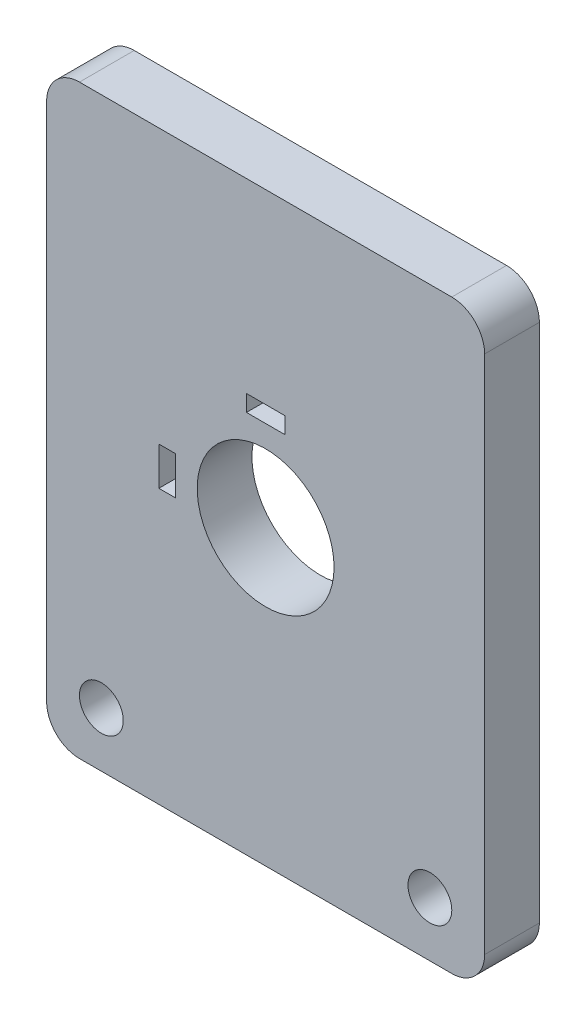
ISO-10303-21;
HEADER;
FILE_DESCRIPTION(('STEP AP214'),'2;1');
FILE_NAME('part.step','',(''),(''),'','','');
FILE_SCHEMA(('AUTOMOTIVE_DESIGN { 1 0 10303 214 1 1 1 1 }'));
ENDSEC;
DATA;
#1=APPLICATION_CONTEXT('core data for automotive mechanical design processes');
#2=APPLICATION_PROTOCOL_DEFINITION('international standard','automotive_design',2000,#1);
#3=PRODUCT_CONTEXT('',#1,'mechanical');
#4=PRODUCT('Part','Part','',(#3));
#5=PRODUCT_RELATED_PRODUCT_CATEGORY('part','',(#4));
#6=PRODUCT_DEFINITION_FORMATION('','',#4);
#7=PRODUCT_DEFINITION_CONTEXT('part definition',#1,'design');
#8=PRODUCT_DEFINITION('design','',#6,#7);
#9=PRODUCT_DEFINITION_SHAPE('','',#8);
#10=(LENGTH_UNIT() NAMED_UNIT(*) SI_UNIT(.MILLI.,.METRE.));
#11=(NAMED_UNIT(*) PLANE_ANGLE_UNIT() SI_UNIT($,.RADIAN.));
#12=(NAMED_UNIT(*) SI_UNIT($,.STERADIAN.) SOLID_ANGLE_UNIT());
#13=UNCERTAINTY_MEASURE_WITH_UNIT(LENGTH_MEASURE(1.E-05),#10,'distance_accuracy_value','');
#14=(GEOMETRIC_REPRESENTATION_CONTEXT(3) GLOBAL_UNCERTAINTY_ASSIGNED_CONTEXT((#13)) GLOBAL_UNIT_ASSIGNED_CONTEXT((#10,
#11,#12)) REPRESENTATION_CONTEXT('',''));
#15=CARTESIAN_POINT('',(0.,0.,0.));
#16=DIRECTION('',(0.,0.,1.));
#17=DIRECTION('',(1.,0.,0.));
#18=AXIS2_PLACEMENT_3D('',#15,#16,#17);
#19=CARTESIAN_POINT('',(0.,0.,5.));
#20=DIRECTION('',(0.,0.,-1.));
#21=DIRECTION('',(-1.,0.,0.));
#22=AXIS2_PLACEMENT_3D('',#19,#20,#21);
#23=PLANE('',#22);
#24=DIRECTION('',(-1.,0.,0.));
#25=VECTOR('',#24,1.);
#26=CARTESIAN_POINT('',(18.25,36.5,5.));
#27=LINE('',#26,#25);
#28=CARTESIAN_POINT('',(21.75,36.5,5.));
#29=VERTEX_POINT('',#28);
#30=CARTESIAN_POINT('',(18.25,36.5,5.));
#31=VERTEX_POINT('',#30);
#32=EDGE_CURVE('E193',#29,#31,#27,.T.);
#33=ORIENTED_EDGE('',*,*,#32,.F.);
#34=DIRECTION('',(0.,1.,0.));
#35=VECTOR('',#34,1.);
#36=CARTESIAN_POINT('',(21.75,36.5,5.));
#37=LINE('',#36,#35);
#38=CARTESIAN_POINT('',(21.75,35.,5.));
#39=VERTEX_POINT('',#38);
#40=EDGE_CURVE('E201',#39,#29,#37,.T.);
#41=ORIENTED_EDGE('',*,*,#40,.F.);
#42=DIRECTION('',(1.,0.,0.));
#43=VECTOR('',#42,1.);
#44=CARTESIAN_POINT('',(21.75,35.,5.));
#45=LINE('',#44,#43);
#46=CARTESIAN_POINT('',(18.25,35.,5.));
#47=VERTEX_POINT('',#46);
#48=EDGE_CURVE('E198',#47,#39,#45,.T.);
#49=ORIENTED_EDGE('',*,*,#48,.F.);
#50=DIRECTION('',(0.,-1.,0.));
#51=VECTOR('',#50,1.);
#52=CARTESIAN_POINT('',(18.25,35.,5.));
#53=LINE('',#52,#51);
#54=EDGE_CURVE('E195',#31,#47,#53,.T.);
#55=ORIENTED_EDGE('',*,*,#54,.F.);
#56=EDGE_LOOP('',(#33,#41,#49,#55));
#57=FACE_BOUND('',#56,.T.);
#58=DIRECTION('',(1.,0.,0.));
#59=VECTOR('',#58,1.);
#60=CARTESIAN_POINT('',(0.,0.,5.));
#61=LINE('',#60,#59);
#62=CARTESIAN_POINT('',(3.,0.,5.));
#63=VERTEX_POINT('',#62);
#64=CARTESIAN_POINT('',(37.,0.,5.));
#65=VERTEX_POINT('',#64);
#66=EDGE_CURVE('E245',#63,#65,#61,.T.);
#67=ORIENTED_EDGE('',*,*,#66,.T.);
#68=CARTESIAN_POINT('',(37.,3.,5.));
#69=DIRECTION('',(0.,0.,-1.));
#70=DIRECTION('',(-1.,0.,0.));
#71=AXIS2_PLACEMENT_3D('',#68,#69,#70);
#72=CIRCLE('',#71,3.);
#73=CARTESIAN_POINT('',(40.,3.,5.));
#74=VERTEX_POINT('',#73);
#75=EDGE_CURVE('E285',#65,#74,#72,.F.);
#76=ORIENTED_EDGE('',*,*,#75,.T.);
#77=DIRECTION('',(0.,1.,0.));
#78=VECTOR('',#77,1.);
#79=CARTESIAN_POINT('',(40.,0.,5.));
#80=LINE('',#79,#78);
#81=CARTESIAN_POINT('',(40.,50.5,5.));
#82=VERTEX_POINT('',#81);
#83=EDGE_CURVE('E249',#74,#82,#80,.T.);
#84=ORIENTED_EDGE('',*,*,#83,.T.);
#85=CARTESIAN_POINT('',(37.,50.5,5.));
#86=DIRECTION('',(0.,0.,-1.));
#87=DIRECTION('',(-1.,0.,0.));
#88=AXIS2_PLACEMENT_3D('',#85,#86,#87);
#89=CIRCLE('',#88,3.);
#90=CARTESIAN_POINT('',(37.,53.5,5.));
#91=VERTEX_POINT('',#90);
#92=EDGE_CURVE('E59',#82,#91,#89,.F.);
#93=ORIENTED_EDGE('',*,*,#92,.T.);
#94=DIRECTION('',(-1.,0.,0.));
#95=VECTOR('',#94,1.);
#96=CARTESIAN_POINT('',(0.,53.5,5.));
#97=LINE('',#96,#95);
#98=CARTESIAN_POINT('',(3.00000000000001,53.5,5.));
#99=VERTEX_POINT('',#98);
#100=EDGE_CURVE('E251',#91,#99,#97,.T.);
#101=ORIENTED_EDGE('',*,*,#100,.T.);
#102=CARTESIAN_POINT('',(3.00000000000001,50.5,5.));
#103=DIRECTION('',(0.,0.,-1.));
#104=DIRECTION('',(-1.,0.,0.));
#105=AXIS2_PLACEMENT_3D('',#102,#103,#104);
#106=CIRCLE('',#105,3.);
#107=CARTESIAN_POINT('',(0.,50.5,5.));
#108=VERTEX_POINT('',#107);
#109=EDGE_CURVE('E280',#99,#108,#106,.F.);
#110=ORIENTED_EDGE('',*,*,#109,.T.);
#111=DIRECTION('',(0.,-1.,0.));
#112=VECTOR('',#111,1.);
#113=CARTESIAN_POINT('',(0.,0.,5.));
#114=LINE('',#113,#112);
#115=CARTESIAN_POINT('',(0.,3.,5.));
#116=VERTEX_POINT('',#115);
#117=EDGE_CURVE('E242',#108,#116,#114,.T.);
#118=ORIENTED_EDGE('',*,*,#117,.T.);
#119=CARTESIAN_POINT('',(3.,3.,5.));
#120=DIRECTION('',(0.,0.,-1.));
#121=DIRECTION('',(-1.,0.,0.));
#122=AXIS2_PLACEMENT_3D('',#119,#120,#121);
#123=CIRCLE('',#122,3.);
#124=EDGE_CURVE('E282',#116,#63,#123,.F.);
#125=ORIENTED_EDGE('',*,*,#124,.T.);
#126=EDGE_LOOP('',(#67,#76,#84,#93,#101,#110,#118,#125));
#127=FACE_BOUND('',#126,.T.);
#128=CARTESIAN_POINT('',(35.,5.,5.));
#129=DIRECTION('',(0.,0.,1.));
#130=DIRECTION('',(1.,0.,0.));
#131=AXIS2_PLACEMENT_3D('',#128,#129,#130);
#132=CIRCLE('',#131,2.);
#133=CARTESIAN_POINT('',(37.,5.,5.));
#134=VERTEX_POINT('',#133);
#135=EDGE_CURVE('E236',#134,#134,#132,.T.);
#136=ORIENTED_EDGE('',*,*,#135,.F.);
#137=EDGE_LOOP('',(#136));
#138=FACE_BOUND('',#137,.T.);
#139=CARTESIAN_POINT('',(5.,5.,5.));
#140=DIRECTION('',(0.,0.,1.));
#141=DIRECTION('',(-1.,0.,0.));
#142=AXIS2_PLACEMENT_3D('',#139,#140,#141);
#143=CIRCLE('',#142,2.);
#144=CARTESIAN_POINT('',(3.,5.,5.));
#145=VERTEX_POINT('',#144);
#146=EDGE_CURVE('E230',#145,#145,#143,.T.);
#147=ORIENTED_EDGE('',*,*,#146,.F.);
#148=EDGE_LOOP('',(#147));
#149=FACE_BOUND('',#148,.T.);
#150=CARTESIAN_POINT('',(20.,26.75,5.));
#151=DIRECTION('',(0.,0.,1.));
#152=DIRECTION('',(1.,0.,0.));
#153=AXIS2_PLACEMENT_3D('',#150,#151,#152);
#154=CIRCLE('',#153,6.25);
#155=CARTESIAN_POINT('',(26.25,26.75,5.));
#156=VERTEX_POINT('',#155);
#157=EDGE_CURVE('E224',#156,#156,#154,.T.);
#158=ORIENTED_EDGE('',*,*,#157,.F.);
#159=EDGE_LOOP('',(#158));
#160=FACE_BOUND('',#159,.T.);
#161=DIRECTION('',(0.,-1.,0.));
#162=VECTOR('',#161,1.);
#163=CARTESIAN_POINT('',(10.25,25.,5.));
#164=LINE('',#163,#162);
#165=CARTESIAN_POINT('',(10.25,28.5,5.));
#166=VERTEX_POINT('',#165);
#167=CARTESIAN_POINT('',(10.25,25.,5.));
#168=VERTEX_POINT('',#167);
#169=EDGE_CURVE('E152',#166,#168,#164,.T.);
#170=ORIENTED_EDGE('',*,*,#169,.F.);
#171=DIRECTION('',(-1.,0.,0.));
#172=VECTOR('',#171,1.);
#173=CARTESIAN_POINT('',(11.75,28.5,5.));
#174=LINE('',#173,#172);
#175=CARTESIAN_POINT('',(11.75,28.5,5.));
#176=VERTEX_POINT('',#175);
#177=EDGE_CURVE('E177',#176,#166,#174,.T.);
#178=ORIENTED_EDGE('',*,*,#177,.F.);
#179=DIRECTION('',(0.,1.,0.));
#180=VECTOR('',#179,1.);
#181=CARTESIAN_POINT('',(11.75,25.,5.));
#182=LINE('',#181,#180);
#183=CARTESIAN_POINT('',(11.75,25.,5.));
#184=VERTEX_POINT('',#183);
#185=EDGE_CURVE('E175',#184,#176,#182,.T.);
#186=ORIENTED_EDGE('',*,*,#185,.F.);
#187=DIRECTION('',(1.,0.,0.));
#188=VECTOR('',#187,1.);
#189=CARTESIAN_POINT('',(11.75,25.,5.));
#190=LINE('',#189,#188);
#191=EDGE_CURVE('E162',#168,#184,#190,.T.);
#192=ORIENTED_EDGE('',*,*,#191,.F.);
#193=EDGE_LOOP('',(#170,#178,#186,#192));
#194=FACE_BOUND('',#193,.T.);
#195=ADVANCED_FACE('F37',(#57,#127,#138,#149,#160,#194),#23,.F.);
#196=CARTESIAN_POINT('',(0.,0.,0.));
#197=DIRECTION('',(0.,0.,-1.));
#198=DIRECTION('',(-1.,0.,0.));
#199=AXIS2_PLACEMENT_3D('',#196,#197,#198);
#200=PLANE('',#199);
#201=CARTESIAN_POINT('',(5.,5.,0.));
#202=DIRECTION('',(0.,0.,1.));
#203=DIRECTION('',(-1.,0.,0.));
#204=AXIS2_PLACEMENT_3D('',#201,#202,#203);
#205=CIRCLE('',#204,2.);
#206=CARTESIAN_POINT('',(3.,5.,0.));
#207=VERTEX_POINT('',#206);
#208=EDGE_CURVE('E227',#207,#207,#205,.T.);
#209=ORIENTED_EDGE('',*,*,#208,.T.);
#210=EDGE_LOOP('',(#209));
#211=FACE_BOUND('',#210,.T.);
#212=DIRECTION('',(0.,1.,0.));
#213=VECTOR('',#212,1.);
#214=CARTESIAN_POINT('',(40.,0.,0.));
#215=LINE('',#214,#213);
#216=CARTESIAN_POINT('',(40.,3.,0.));
#217=VERTEX_POINT('',#216);
#218=CARTESIAN_POINT('',(40.,50.5,0.));
#219=VERTEX_POINT('',#218);
#220=EDGE_CURVE('E259',#217,#219,#215,.T.);
#221=ORIENTED_EDGE('',*,*,#220,.F.);
#222=CARTESIAN_POINT('',(37.,3.,0.));
#223=DIRECTION('',(0.,0.,-1.));
#224=DIRECTION('',(-1.,0.,0.));
#225=AXIS2_PLACEMENT_3D('',#222,#223,#224);
#226=CIRCLE('',#225,3.);
#227=CARTESIAN_POINT('',(37.,0.,0.));
#228=VERTEX_POINT('',#227);
#229=EDGE_CURVE('E273',#217,#228,#226,.T.);
#230=ORIENTED_EDGE('',*,*,#229,.T.);
#231=DIRECTION('',(1.,0.,0.));
#232=VECTOR('',#231,1.);
#233=CARTESIAN_POINT('',(0.,0.,0.));
#234=LINE('',#233,#232);
#235=CARTESIAN_POINT('',(3.,0.,0.));
#236=VERTEX_POINT('',#235);
#237=EDGE_CURVE('E256',#236,#228,#234,.T.);
#238=ORIENTED_EDGE('',*,*,#237,.F.);
#239=CARTESIAN_POINT('',(3.,3.,0.));
#240=DIRECTION('',(0.,0.,-1.));
#241=DIRECTION('',(-1.,0.,0.));
#242=AXIS2_PLACEMENT_3D('',#239,#240,#241);
#243=CIRCLE('',#242,3.);
#244=CARTESIAN_POINT('',(0.,3.,0.));
#245=VERTEX_POINT('',#244);
#246=EDGE_CURVE('E269',#236,#245,#243,.T.);
#247=ORIENTED_EDGE('',*,*,#246,.T.);
#248=DIRECTION('',(0.,-1.,0.));
#249=VECTOR('',#248,1.);
#250=CARTESIAN_POINT('',(0.,0.,0.));
#251=LINE('',#250,#249);
#252=CARTESIAN_POINT('',(0.,50.5,0.));
#253=VERTEX_POINT('',#252);
#254=EDGE_CURVE('E239',#253,#245,#251,.T.);
#255=ORIENTED_EDGE('',*,*,#254,.F.);
#256=CARTESIAN_POINT('',(3.00000000000001,50.5,0.));
#257=DIRECTION('',(0.,0.,-1.));
#258=DIRECTION('',(-1.,0.,0.));
#259=AXIS2_PLACEMENT_3D('',#256,#257,#258);
#260=CIRCLE('',#259,3.);
#261=CARTESIAN_POINT('',(3.00000000000001,53.5,0.));
#262=VERTEX_POINT('',#261);
#263=EDGE_CURVE('E267',#253,#262,#260,.T.);
#264=ORIENTED_EDGE('',*,*,#263,.T.);
#265=DIRECTION('',(-1.,0.,0.));
#266=VECTOR('',#265,1.);
#267=CARTESIAN_POINT('',(0.,53.5,0.));
#268=LINE('',#267,#266);
#269=CARTESIAN_POINT('',(37.,53.5,0.));
#270=VERTEX_POINT('',#269);
#271=EDGE_CURVE('E246',#270,#262,#268,.T.);
#272=ORIENTED_EDGE('',*,*,#271,.F.);
#273=CARTESIAN_POINT('',(37.,50.5,0.));
#274=DIRECTION('',(0.,0.,-1.));
#275=DIRECTION('',(-1.,0.,0.));
#276=AXIS2_PLACEMENT_3D('',#273,#274,#275);
#277=CIRCLE('',#276,3.);
#278=EDGE_CURVE('E271',#270,#219,#277,.T.);
#279=ORIENTED_EDGE('',*,*,#278,.T.);
#280=EDGE_LOOP('',(#221,#230,#238,#247,#255,#264,#272,#279));
#281=FACE_BOUND('',#280,.T.);
#282=CARTESIAN_POINT('',(35.,5.,0.));
#283=DIRECTION('',(0.,0.,1.));
#284=DIRECTION('',(1.,0.,0.));
#285=AXIS2_PLACEMENT_3D('',#282,#283,#284);
#286=CIRCLE('',#285,2.);
#287=CARTESIAN_POINT('',(37.,5.,0.));
#288=VERTEX_POINT('',#287);
#289=EDGE_CURVE('E233',#288,#288,#286,.T.);
#290=ORIENTED_EDGE('',*,*,#289,.T.);
#291=EDGE_LOOP('',(#290));
#292=FACE_BOUND('',#291,.T.);
#293=CARTESIAN_POINT('',(20.,26.75,0.));
#294=DIRECTION('',(0.,0.,1.));
#295=DIRECTION('',(1.,0.,0.));
#296=AXIS2_PLACEMENT_3D('',#293,#294,#295);
#297=CIRCLE('',#296,6.25);
#298=CARTESIAN_POINT('',(26.25,26.75,0.));
#299=VERTEX_POINT('',#298);
#300=EDGE_CURVE('E223',#299,#299,#297,.T.);
#301=ORIENTED_EDGE('',*,*,#300,.T.);
#302=EDGE_LOOP('',(#301));
#303=FACE_BOUND('',#302,.T.);
#304=DIRECTION('',(0.,1.,0.));
#305=VECTOR('',#304,1.);
#306=CARTESIAN_POINT('',(21.75,36.5,0.));
#307=LINE('',#306,#305);
#308=CARTESIAN_POINT('',(21.75,35.,0.));
#309=VERTEX_POINT('',#308);
#310=CARTESIAN_POINT('',(21.75,36.5,0.));
#311=VERTEX_POINT('',#310);
#312=EDGE_CURVE('E196',#309,#311,#307,.T.);
#313=ORIENTED_EDGE('',*,*,#312,.T.);
#314=DIRECTION('',(-1.,0.,0.));
#315=VECTOR('',#314,1.);
#316=CARTESIAN_POINT('',(18.25,36.5,0.));
#317=LINE('',#316,#315);
#318=CARTESIAN_POINT('',(18.25,36.5,0.));
#319=VERTEX_POINT('',#318);
#320=EDGE_CURVE('E170',#311,#319,#317,.T.);
#321=ORIENTED_EDGE('',*,*,#320,.T.);
#322=DIRECTION('',(0.,-1.,0.));
#323=VECTOR('',#322,1.);
#324=CARTESIAN_POINT('',(18.25,35.,0.));
#325=LINE('',#324,#323);
#326=CARTESIAN_POINT('',(18.25,35.,0.));
#327=VERTEX_POINT('',#326);
#328=EDGE_CURVE('E206',#319,#327,#325,.T.);
#329=ORIENTED_EDGE('',*,*,#328,.T.);
#330=DIRECTION('',(1.,0.,0.));
#331=VECTOR('',#330,1.);
#332=CARTESIAN_POINT('',(21.75,35.,0.));
#333=LINE('',#332,#331);
#334=EDGE_CURVE('E209',#327,#309,#333,.T.);
#335=ORIENTED_EDGE('',*,*,#334,.T.);
#336=EDGE_LOOP('',(#313,#321,#329,#335));
#337=FACE_BOUND('',#336,.T.);
#338=DIRECTION('',(-1.,0.,0.));
#339=VECTOR('',#338,1.);
#340=CARTESIAN_POINT('',(11.75,28.5,0.));
#341=LINE('',#340,#339);
#342=CARTESIAN_POINT('',(11.75,28.5,0.));
#343=VERTEX_POINT('',#342);
#344=CARTESIAN_POINT('',(10.25,28.5,0.));
#345=VERTEX_POINT('',#344);
#346=EDGE_CURVE('E163',#343,#345,#341,.T.);
#347=ORIENTED_EDGE('',*,*,#346,.T.);
#348=DIRECTION('',(0.,-1.,0.));
#349=VECTOR('',#348,1.);
#350=CARTESIAN_POINT('',(10.25,25.,0.));
#351=LINE('',#350,#349);
#352=CARTESIAN_POINT('',(10.25,25.,0.));
#353=VERTEX_POINT('',#352);
#354=EDGE_CURVE('E181',#345,#353,#351,.T.);
#355=ORIENTED_EDGE('',*,*,#354,.T.);
#356=DIRECTION('',(1.,0.,0.));
#357=VECTOR('',#356,1.);
#358=CARTESIAN_POINT('',(11.75,25.,0.));
#359=LINE('',#358,#357);
#360=CARTESIAN_POINT('',(11.75,25.,0.));
#361=VERTEX_POINT('',#360);
#362=EDGE_CURVE('E169',#353,#361,#359,.T.);
#363=ORIENTED_EDGE('',*,*,#362,.T.);
#364=DIRECTION('',(0.,1.,0.));
#365=VECTOR('',#364,1.);
#366=CARTESIAN_POINT('',(11.75,25.,0.));
#367=LINE('',#366,#365);
#368=EDGE_CURVE('E184',#361,#343,#367,.T.);
#369=ORIENTED_EDGE('',*,*,#368,.T.);
#370=EDGE_LOOP('',(#347,#355,#363,#369));
#371=FACE_BOUND('',#370,.T.);
#372=ADVANCED_FACE('F301',(#211,#281,#292,#303,#337,#371),#200,.T.);
#373=CARTESIAN_POINT('',(0.,0.,5.));
#374=DIRECTION('',(1.,0.,0.));
#375=DIRECTION('',(0.,1.,0.));
#376=AXIS2_PLACEMENT_3D('',#373,#374,#375);
#377=PLANE('',#376);
#378=ORIENTED_EDGE('',*,*,#254,.T.);
#379=DIRECTION('',(0.,0.,-1.));
#380=VECTOR('',#379,1.);
#381=CARTESIAN_POINT('',(0.,3.,5.));
#382=LINE('',#381,#380);
#383=EDGE_CURVE('E11',#245,#116,#382,.F.);
#384=ORIENTED_EDGE('',*,*,#383,.T.);
#385=ORIENTED_EDGE('',*,*,#117,.F.);
#386=DIRECTION('',(0.,0.,-1.));
#387=VECTOR('',#386,1.);
#388=CARTESIAN_POINT('',(0.,50.5,5.));
#389=LINE('',#388,#387);
#390=EDGE_CURVE('E45',#108,#253,#389,.T.);
#391=ORIENTED_EDGE('',*,*,#390,.T.);
#392=EDGE_LOOP('',(#378,#384,#385,#391));
#393=FACE_BOUND('',#392,.T.);
#394=ADVANCED_FACE('F295',(#393),#377,.F.);
#395=CARTESIAN_POINT('',(0.,0.,5.));
#396=DIRECTION('',(0.,1.,0.));
#397=DIRECTION('',(0.,0.,1.));
#398=AXIS2_PLACEMENT_3D('',#395,#396,#397);
#399=PLANE('',#398);
#400=ORIENTED_EDGE('',*,*,#237,.T.);
#401=DIRECTION('',(0.,0.,-1.));
#402=VECTOR('',#401,1.);
#403=CARTESIAN_POINT('',(37.,0.,5.));
#404=LINE('',#403,#402);
#405=EDGE_CURVE('E278',#228,#65,#404,.F.);
#406=ORIENTED_EDGE('',*,*,#405,.T.);
#407=ORIENTED_EDGE('',*,*,#66,.F.);
#408=DIRECTION('',(0.,0.,-1.));
#409=VECTOR('',#408,1.);
#410=CARTESIAN_POINT('',(3.,0.,5.));
#411=LINE('',#410,#409);
#412=EDGE_CURVE('E275',#63,#236,#411,.T.);
#413=ORIENTED_EDGE('',*,*,#412,.T.);
#414=EDGE_LOOP('',(#400,#406,#407,#413));
#415=FACE_BOUND('',#414,.T.);
#416=ADVANCED_FACE('F311',(#415),#399,.F.);
#417=CARTESIAN_POINT('',(40.,0.,5.));
#418=DIRECTION('',(-1.,0.,0.));
#419=DIRECTION('',(0.,0.,1.));
#420=AXIS2_PLACEMENT_3D('',#417,#418,#419);
#421=PLANE('',#420);
#422=ORIENTED_EDGE('',*,*,#83,.F.);
#423=DIRECTION('',(0.,0.,-1.));
#424=VECTOR('',#423,1.);
#425=CARTESIAN_POINT('',(40.,3.,5.));
#426=LINE('',#425,#424);
#427=EDGE_CURVE('E264',#74,#217,#426,.T.);
#428=ORIENTED_EDGE('',*,*,#427,.T.);
#429=ORIENTED_EDGE('',*,*,#220,.T.);
#430=DIRECTION('',(0.,0.,-1.));
#431=VECTOR('',#430,1.);
#432=CARTESIAN_POINT('',(40.,50.5,5.));
#433=LINE('',#432,#431);
#434=EDGE_CURVE('E253',#219,#82,#433,.F.);
#435=ORIENTED_EDGE('',*,*,#434,.T.);
#436=EDGE_LOOP('',(#422,#428,#429,#435));
#437=FACE_BOUND('',#436,.T.);
#438=ADVANCED_FACE('F320',(#437),#421,.F.);
#439=CARTESIAN_POINT('',(0.,53.5,5.));
#440=DIRECTION('',(0.,-1.,0.));
#441=DIRECTION('',(0.,0.,-1.));
#442=AXIS2_PLACEMENT_3D('',#439,#440,#441);
#443=PLANE('',#442);
#444=ORIENTED_EDGE('',*,*,#100,.F.);
#445=DIRECTION('',(0.,0.,-1.));
#446=VECTOR('',#445,1.);
#447=CARTESIAN_POINT('',(37.,53.5,5.));
#448=LINE('',#447,#446);
#449=EDGE_CURVE('E288',#91,#270,#448,.T.);
#450=ORIENTED_EDGE('',*,*,#449,.T.);
#451=ORIENTED_EDGE('',*,*,#271,.T.);
#452=DIRECTION('',(0.,0.,-1.));
#453=VECTOR('',#452,1.);
#454=CARTESIAN_POINT('',(3.00000000000001,53.5,5.));
#455=LINE('',#454,#453);
#456=EDGE_CURVE('E52',#262,#99,#455,.F.);
#457=ORIENTED_EDGE('',*,*,#456,.T.);
#458=EDGE_LOOP('',(#444,#450,#451,#457));
#459=FACE_BOUND('',#458,.T.);
#460=ADVANCED_FACE('F325',(#459),#443,.F.);
#461=CARTESIAN_POINT('',(35.,5.,5.));
#462=DIRECTION('',(0.,0.,-1.));
#463=DIRECTION('',(-1.,0.,0.));
#464=AXIS2_PLACEMENT_3D('',#461,#462,#463);
#465=CYLINDRICAL_SURFACE('',#464,2.);
#466=ORIENTED_EDGE('',*,*,#135,.T.);
#467=EDGE_LOOP('',(#466));
#468=FACE_BOUND('',#467,.T.);
#469=ORIENTED_EDGE('',*,*,#289,.F.);
#470=EDGE_LOOP('',(#469));
#471=FACE_BOUND('',#470,.T.);
#472=ADVANCED_FACE('F340',(#468,#471),#465,.F.);
#473=CARTESIAN_POINT('',(5.,5.,5.));
#474=DIRECTION('',(0.,0.,-1.));
#475=DIRECTION('',(-1.,0.,0.));
#476=AXIS2_PLACEMENT_3D('',#473,#474,#475);
#477=CYLINDRICAL_SURFACE('',#476,2.);
#478=ORIENTED_EDGE('',*,*,#146,.T.);
#479=EDGE_LOOP('',(#478));
#480=FACE_BOUND('',#479,.T.);
#481=ORIENTED_EDGE('',*,*,#208,.F.);
#482=EDGE_LOOP('',(#481));
#483=FACE_BOUND('',#482,.T.);
#484=ADVANCED_FACE('F452',(#480,#483),#477,.F.);
#485=CARTESIAN_POINT('',(20.,26.75,5.));
#486=DIRECTION('',(0.,0.,-1.));
#487=DIRECTION('',(-1.,0.,0.));
#488=AXIS2_PLACEMENT_3D('',#485,#486,#487);
#489=CYLINDRICAL_SURFACE('',#488,6.25);
#490=ORIENTED_EDGE('',*,*,#157,.T.);
#491=EDGE_LOOP('',(#490));
#492=FACE_BOUND('',#491,.T.);
#493=ORIENTED_EDGE('',*,*,#300,.F.);
#494=EDGE_LOOP('',(#493));
#495=FACE_BOUND('',#494,.T.);
#496=ADVANCED_FACE('F443',(#492,#495),#489,.F.);
#497=CARTESIAN_POINT('',(18.25,36.5,5.));
#498=DIRECTION('',(0.,-1.,0.));
#499=DIRECTION('',(0.,0.,-1.));
#500=AXIS2_PLACEMENT_3D('',#497,#498,#499);
#501=PLANE('',#500);
#502=ORIENTED_EDGE('',*,*,#320,.F.);
#503=DIRECTION('',(0.,0.,-1.));
#504=VECTOR('',#503,1.);
#505=CARTESIAN_POINT('',(21.75,36.5,5.));
#506=LINE('',#505,#504);
#507=EDGE_CURVE('E203',#29,#311,#506,.T.);
#508=ORIENTED_EDGE('',*,*,#507,.F.);
#509=ORIENTED_EDGE('',*,*,#32,.T.);
#510=DIRECTION('',(0.,0.,-1.));
#511=VECTOR('',#510,1.);
#512=CARTESIAN_POINT('',(18.25,36.5,5.));
#513=LINE('',#512,#511);
#514=EDGE_CURVE('E220',#31,#319,#513,.T.);
#515=ORIENTED_EDGE('',*,*,#514,.T.);
#516=EDGE_LOOP('',(#502,#508,#509,#515));
#517=FACE_BOUND('',#516,.T.);
#518=ADVANCED_FACE('F434',(#517),#501,.T.);
#519=CARTESIAN_POINT('',(18.25,35.,5.));
#520=DIRECTION('',(1.,0.,0.));
#521=DIRECTION('',(0.,1.,0.));
#522=AXIS2_PLACEMENT_3D('',#519,#520,#521);
#523=PLANE('',#522);
#524=ORIENTED_EDGE('',*,*,#328,.F.);
#525=ORIENTED_EDGE('',*,*,#514,.F.);
#526=ORIENTED_EDGE('',*,*,#54,.T.);
#527=DIRECTION('',(0.,0.,-1.));
#528=VECTOR('',#527,1.);
#529=CARTESIAN_POINT('',(18.25,35.,5.));
#530=LINE('',#529,#528);
#531=EDGE_CURVE('E218',#47,#327,#530,.T.);
#532=ORIENTED_EDGE('',*,*,#531,.T.);
#533=EDGE_LOOP('',(#524,#525,#526,#532));
#534=FACE_BOUND('',#533,.T.);
#535=ADVANCED_FACE('F425',(#534),#523,.T.);
#536=CARTESIAN_POINT('',(21.75,35.,5.));
#537=DIRECTION('',(0.,1.,0.));
#538=DIRECTION('',(0.,0.,1.));
#539=AXIS2_PLACEMENT_3D('',#536,#537,#538);
#540=PLANE('',#539);
#541=ORIENTED_EDGE('',*,*,#334,.F.);
#542=ORIENTED_EDGE('',*,*,#531,.F.);
#543=ORIENTED_EDGE('',*,*,#48,.T.);
#544=DIRECTION('',(0.,0.,-1.));
#545=VECTOR('',#544,1.);
#546=CARTESIAN_POINT('',(21.75,35.,5.));
#547=LINE('',#546,#545);
#548=EDGE_CURVE('E216',#39,#309,#547,.T.);
#549=ORIENTED_EDGE('',*,*,#548,.T.);
#550=EDGE_LOOP('',(#541,#542,#543,#549));
#551=FACE_BOUND('',#550,.T.);
#552=ADVANCED_FACE('F416',(#551),#540,.T.);
#553=CARTESIAN_POINT('',(21.75,36.5,5.));
#554=DIRECTION('',(-1.,0.,0.));
#555=DIRECTION('',(0.,-1.,0.));
#556=AXIS2_PLACEMENT_3D('',#553,#554,#555);
#557=PLANE('',#556);
#558=ORIENTED_EDGE('',*,*,#312,.F.);
#559=ORIENTED_EDGE('',*,*,#548,.F.);
#560=ORIENTED_EDGE('',*,*,#40,.T.);
#561=ORIENTED_EDGE('',*,*,#507,.T.);
#562=EDGE_LOOP('',(#558,#559,#560,#561));
#563=FACE_BOUND('',#562,.T.);
#564=ADVANCED_FACE('F408',(#563),#557,.T.);
#565=CARTESIAN_POINT('',(10.25,25.,5.));
#566=DIRECTION('',(1.,0.,0.));
#567=DIRECTION('',(0.,0.,-1.));
#568=AXIS2_PLACEMENT_3D('',#565,#566,#567);
#569=PLANE('',#568);
#570=ORIENTED_EDGE('',*,*,#354,.F.);
#571=DIRECTION('',(0.,0.,-1.));
#572=VECTOR('',#571,1.);
#573=CARTESIAN_POINT('',(10.25,28.5,5.));
#574=LINE('',#573,#572);
#575=EDGE_CURVE('E158',#166,#345,#574,.T.);
#576=ORIENTED_EDGE('',*,*,#575,.F.);
#577=ORIENTED_EDGE('',*,*,#169,.T.);
#578=DIRECTION('',(0.,0.,-1.));
#579=VECTOR('',#578,1.);
#580=CARTESIAN_POINT('',(10.25,25.,5.));
#581=LINE('',#580,#579);
#582=EDGE_CURVE('E155',#168,#353,#581,.T.);
#583=ORIENTED_EDGE('',*,*,#582,.T.);
#584=EDGE_LOOP('',(#570,#576,#577,#583));
#585=FACE_BOUND('',#584,.T.);
#586=ADVANCED_FACE('F154',(#585),#569,.T.);
#587=CARTESIAN_POINT('',(11.75,25.,5.));
#588=DIRECTION('',(0.,1.,0.));
#589=DIRECTION('',(0.,0.,1.));
#590=AXIS2_PLACEMENT_3D('',#587,#588,#589);
#591=PLANE('',#590);
#592=ORIENTED_EDGE('',*,*,#362,.F.);
#593=ORIENTED_EDGE('',*,*,#582,.F.);
#594=ORIENTED_EDGE('',*,*,#191,.T.);
#595=DIRECTION('',(0.,0.,-1.));
#596=VECTOR('',#595,1.);
#597=CARTESIAN_POINT('',(11.75,25.,5.));
#598=LINE('',#597,#596);
#599=EDGE_CURVE('E171',#184,#361,#598,.T.);
#600=ORIENTED_EDGE('',*,*,#599,.T.);
#601=EDGE_LOOP('',(#592,#593,#594,#600));
#602=FACE_BOUND('',#601,.T.);
#603=ADVANCED_FACE('F166',(#602),#591,.T.);
#604=CARTESIAN_POINT('',(11.75,25.,5.));
#605=DIRECTION('',(-1.,0.,0.));
#606=DIRECTION('',(0.,0.,1.));
#607=AXIS2_PLACEMENT_3D('',#604,#605,#606);
#608=PLANE('',#607);
#609=ORIENTED_EDGE('',*,*,#368,.F.);
#610=ORIENTED_EDGE('',*,*,#599,.F.);
#611=ORIENTED_EDGE('',*,*,#185,.T.);
#612=DIRECTION('',(0.,0.,-1.));
#613=VECTOR('',#612,1.);
#614=CARTESIAN_POINT('',(11.75,28.5,5.));
#615=LINE('',#614,#613);
#616=EDGE_CURVE('E190',#176,#343,#615,.T.);
#617=ORIENTED_EDGE('',*,*,#616,.T.);
#618=EDGE_LOOP('',(#609,#610,#611,#617));
#619=FACE_BOUND('',#618,.T.);
#620=ADVANCED_FACE('F384',(#619),#608,.T.);
#621=CARTESIAN_POINT('',(11.75,28.5,5.));
#622=DIRECTION('',(0.,-1.,0.));
#623=DIRECTION('',(0.,0.,-1.));
#624=AXIS2_PLACEMENT_3D('',#621,#622,#623);
#625=PLANE('',#624);
#626=ORIENTED_EDGE('',*,*,#346,.F.);
#627=ORIENTED_EDGE('',*,*,#616,.F.);
#628=ORIENTED_EDGE('',*,*,#177,.T.);
#629=ORIENTED_EDGE('',*,*,#575,.T.);
#630=EDGE_LOOP('',(#626,#627,#628,#629));
#631=FACE_BOUND('',#630,.T.);
#632=ADVANCED_FACE('F353',(#631),#625,.T.);
#633=CARTESIAN_POINT('',(37.,3.,5.));
#634=DIRECTION('',(0.,0.,-1.));
#635=DIRECTION('',(-1.,0.,0.));
#636=AXIS2_PLACEMENT_3D('',#633,#634,#635);
#637=CYLINDRICAL_SURFACE('',#636,3.);
#638=ORIENTED_EDGE('',*,*,#75,.F.);
#639=ORIENTED_EDGE('',*,*,#405,.F.);
#640=ORIENTED_EDGE('',*,*,#229,.F.);
#641=ORIENTED_EDGE('',*,*,#427,.F.);
#642=EDGE_LOOP('',(#638,#639,#640,#641));
#643=FACE_BOUND('',#642,.T.);
#644=ADVANCED_FACE('F318',(#643),#637,.T.);
#645=CARTESIAN_POINT('',(37.,50.5,5.));
#646=DIRECTION('',(0.,0.,-1.));
#647=DIRECTION('',(-1.,0.,0.));
#648=AXIS2_PLACEMENT_3D('',#645,#646,#647);
#649=CYLINDRICAL_SURFACE('',#648,3.);
#650=ORIENTED_EDGE('',*,*,#92,.F.);
#651=ORIENTED_EDGE('',*,*,#434,.F.);
#652=ORIENTED_EDGE('',*,*,#278,.F.);
#653=ORIENTED_EDGE('',*,*,#449,.F.);
#654=EDGE_LOOP('',(#650,#651,#652,#653));
#655=FACE_BOUND('',#654,.T.);
#656=ADVANCED_FACE('F324',(#655),#649,.T.);
#657=CARTESIAN_POINT('',(3.,3.,5.));
#658=DIRECTION('',(0.,0.,-1.));
#659=DIRECTION('',(-1.,0.,0.));
#660=AXIS2_PLACEMENT_3D('',#657,#658,#659);
#661=CYLINDRICAL_SURFACE('',#660,3.);
#662=ORIENTED_EDGE('',*,*,#124,.F.);
#663=ORIENTED_EDGE('',*,*,#383,.F.);
#664=ORIENTED_EDGE('',*,*,#246,.F.);
#665=ORIENTED_EDGE('',*,*,#412,.F.);
#666=EDGE_LOOP('',(#662,#663,#664,#665));
#667=FACE_BOUND('',#666,.T.);
#668=ADVANCED_FACE('F308',(#667),#661,.T.);
#669=CARTESIAN_POINT('',(3.00000000000001,50.5,5.));
#670=DIRECTION('',(0.,0.,-1.));
#671=DIRECTION('',(-1.,0.,0.));
#672=AXIS2_PLACEMENT_3D('',#669,#670,#671);
#673=CYLINDRICAL_SURFACE('',#672,3.);
#674=ORIENTED_EDGE('',*,*,#109,.F.);
#675=ORIENTED_EDGE('',*,*,#456,.F.);
#676=ORIENTED_EDGE('',*,*,#263,.F.);
#677=ORIENTED_EDGE('',*,*,#390,.F.);
#678=EDGE_LOOP('',(#674,#675,#676,#677));
#679=FACE_BOUND('',#678,.T.);
#680=ADVANCED_FACE('F39',(#679),#673,.T.);
#681=CLOSED_SHELL('',(#195,#372,#394,#416,#438,#460,#472,#484,#496,#518,#535,#552,#564,#586,
#603,#620,#632,#644,#656,#668,#680));
#682=MANIFOLD_SOLID_BREP('B2',#681);
#683=ADVANCED_BREP_SHAPE_REPRESENTATION('',(#18,#682),#14);
#684=SHAPE_DEFINITION_REPRESENTATION(#9,#683);
ENDSEC;
END-ISO-10303-21;
